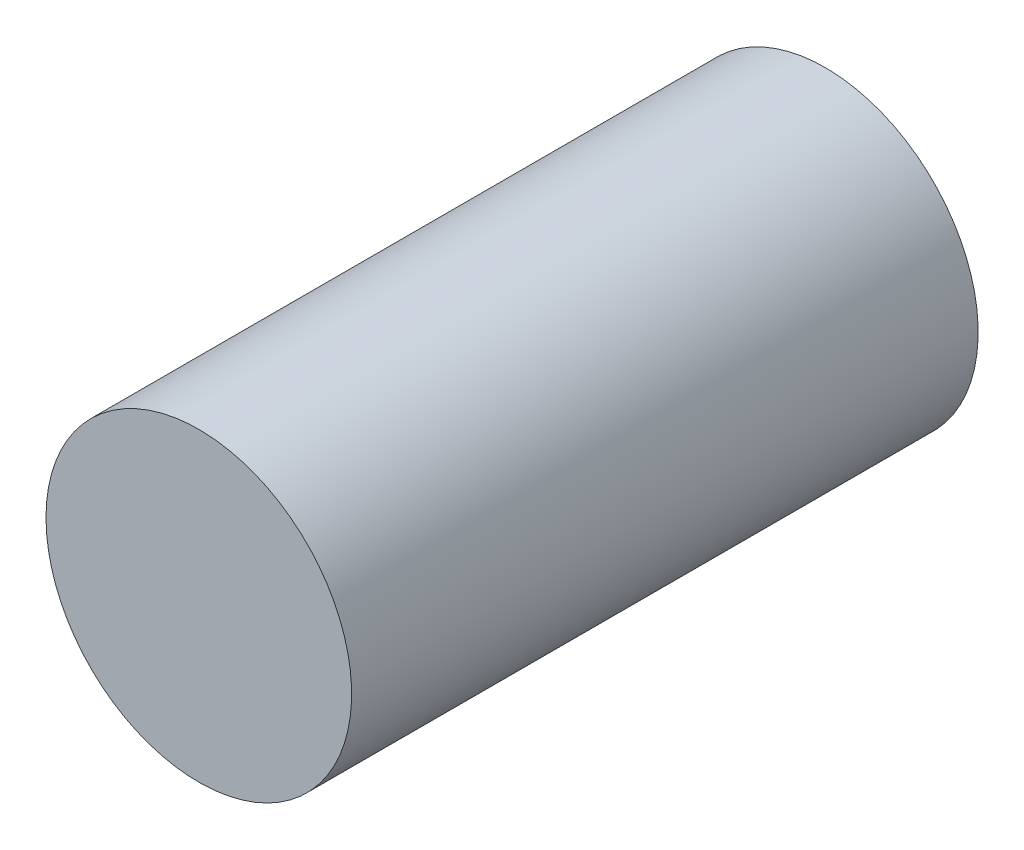
ISO-10303-21;
HEADER;
FILE_DESCRIPTION(('STEP AP214'),'2;1');
FILE_NAME('part.step','',(''),(''),'','','');
FILE_SCHEMA(('AUTOMOTIVE_DESIGN { 1 0 10303 214 1 1 1 1 }'));
ENDSEC;
DATA;
#1=APPLICATION_CONTEXT('core data for automotive mechanical design processes');
#2=APPLICATION_PROTOCOL_DEFINITION('international standard','automotive_design',2000,#1);
#3=PRODUCT_CONTEXT('',#1,'mechanical');
#4=PRODUCT('Part','Part','',(#3));
#5=PRODUCT_RELATED_PRODUCT_CATEGORY('part','',(#4));
#6=PRODUCT_DEFINITION_FORMATION('','',#4);
#7=PRODUCT_DEFINITION_CONTEXT('part definition',#1,'design');
#8=PRODUCT_DEFINITION('design','',#6,#7);
#9=PRODUCT_DEFINITION_SHAPE('','',#8);
#10=(LENGTH_UNIT() NAMED_UNIT(*) SI_UNIT(.MILLI.,.METRE.));
#11=(NAMED_UNIT(*) PLANE_ANGLE_UNIT() SI_UNIT($,.RADIAN.));
#12=(NAMED_UNIT(*) SI_UNIT($,.STERADIAN.) SOLID_ANGLE_UNIT());
#13=UNCERTAINTY_MEASURE_WITH_UNIT(LENGTH_MEASURE(1.E-05),#10,'distance_accuracy_value','');
#14=(GEOMETRIC_REPRESENTATION_CONTEXT(3) GLOBAL_UNCERTAINTY_ASSIGNED_CONTEXT((#13)) GLOBAL_UNIT_ASSIGNED_CONTEXT((#10,
#11,#12)) REPRESENTATION_CONTEXT('',''));
#15=CARTESIAN_POINT('',(0.,0.,0.));
#16=DIRECTION('',(0.,0.,1.));
#17=DIRECTION('',(1.,0.,0.));
#18=AXIS2_PLACEMENT_3D('',#15,#16,#17);
#19=CARTESIAN_POINT('',(1.00000054,0.,0.));
#20=DIRECTION('',(0.,0.,-1.));
#21=DIRECTION('',(-1.,0.,0.));
#22=AXIS2_PLACEMENT_3D('',#19,#20,#21);
#23=PLANE('',#22);
#24=CARTESIAN_POINT('',(0.,0.,0.));
#25=DIRECTION('',(0.,0.,-1.));
#26=DIRECTION('',(-1.,0.,0.));
#27=AXIS2_PLACEMENT_3D('',#24,#25,#26);
#28=CIRCLE('',#27,1.00000054);
#29=CARTESIAN_POINT('',(-1.00000054,0.,0.));
#30=VERTEX_POINT('',#29);
#31=EDGE_CURVE('E18',#30,#30,#28,.F.);
#32=ORIENTED_EDGE('',*,*,#31,.F.);
#33=EDGE_LOOP('',(#32));
#34=FACE_BOUND('',#33,.T.);
#35=ADVANCED_FACE('F15',(#34),#23,.T.);
#36=CARTESIAN_POINT('',(1.00000054,0.,4.09999942));
#37=DIRECTION('',(0.,0.,-1.));
#38=DIRECTION('',(-1.,0.,0.));
#39=AXIS2_PLACEMENT_3D('',#36,#37,#38);
#40=PLANE('',#39);
#41=CARTESIAN_POINT('',(0.,0.,4.09999942));
#42=DIRECTION('',(0.,0.,-1.));
#43=DIRECTION('',(-1.,0.,0.));
#44=AXIS2_PLACEMENT_3D('',#41,#42,#43);
#45=CIRCLE('',#44,1.00000054);
#46=CARTESIAN_POINT('',(-1.00000054,0.,4.09999942));
#47=VERTEX_POINT('',#46);
#48=EDGE_CURVE('E10',#47,#47,#45,.T.);
#49=ORIENTED_EDGE('',*,*,#48,.F.);
#50=EDGE_LOOP('',(#49));
#51=FACE_BOUND('',#50,.T.);
#52=ADVANCED_FACE('F30',(#51),#40,.F.);
#53=CARTESIAN_POINT('',(0.,0.,0.));
#54=DIRECTION('',(0.,0.,-1.));
#55=DIRECTION('',(-1.,0.,0.));
#56=AXIS2_PLACEMENT_3D('',#53,#54,#55);
#57=CYLINDRICAL_SURFACE('',#56,1.00000054);
#58=ORIENTED_EDGE('',*,*,#48,.T.);
#59=EDGE_LOOP('',(#58));
#60=FACE_BOUND('',#59,.T.);
#61=ORIENTED_EDGE('',*,*,#31,.T.);
#62=EDGE_LOOP('',(#61));
#63=FACE_BOUND('',#62,.T.);
#64=ADVANCED_FACE('F27',(#60,#63),#57,.T.);
#65=CLOSED_SHELL('',(#35,#52,#64));
#66=MANIFOLD_SOLID_BREP('B1',#65);
#67=ADVANCED_BREP_SHAPE_REPRESENTATION('',(#18,#66),#14);
#68=SHAPE_DEFINITION_REPRESENTATION(#9,#67);
ENDSEC;
END-ISO-10303-21;
